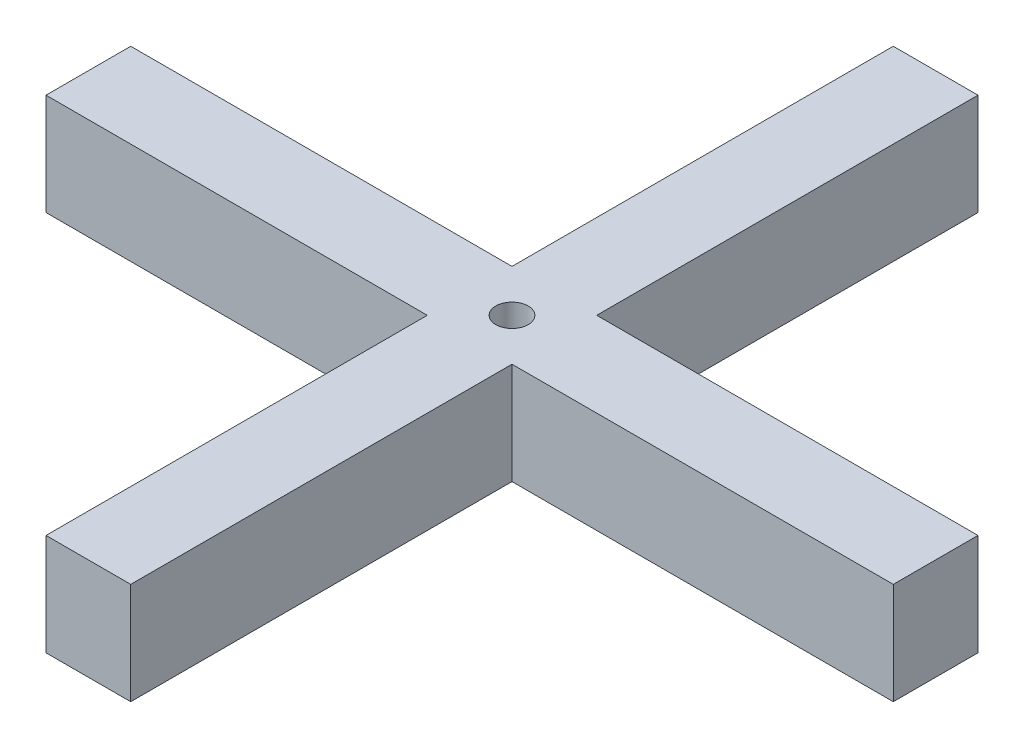
ISO-10303-21;
HEADER;
FILE_DESCRIPTION(('STEP AP214'),'2;1');
FILE_NAME('part.step','',(''),(''),'','','');
FILE_SCHEMA(('AUTOMOTIVE_DESIGN { 1 0 10303 214 1 1 1 1 }'));
ENDSEC;
DATA;
#1=APPLICATION_CONTEXT('core data for automotive mechanical design processes');
#2=APPLICATION_PROTOCOL_DEFINITION('international standard','automotive_design',2000,#1);
#3=PRODUCT_CONTEXT('',#1,'mechanical');
#4=PRODUCT('Part','Part','',(#3));
#5=PRODUCT_RELATED_PRODUCT_CATEGORY('part','',(#4));
#6=PRODUCT_DEFINITION_FORMATION('','',#4);
#7=PRODUCT_DEFINITION_CONTEXT('part definition',#1,'design');
#8=PRODUCT_DEFINITION('design','',#6,#7);
#9=PRODUCT_DEFINITION_SHAPE('','',#8);
#10=(LENGTH_UNIT() NAMED_UNIT(*) SI_UNIT(.MILLI.,.METRE.));
#11=(NAMED_UNIT(*) PLANE_ANGLE_UNIT() SI_UNIT($,.RADIAN.));
#12=(NAMED_UNIT(*) SI_UNIT($,.STERADIAN.) SOLID_ANGLE_UNIT());
#13=UNCERTAINTY_MEASURE_WITH_UNIT(LENGTH_MEASURE(1.E-05),#10,'distance_accuracy_value','');
#14=(GEOMETRIC_REPRESENTATION_CONTEXT(3) GLOBAL_UNCERTAINTY_ASSIGNED_CONTEXT((#13)) GLOBAL_UNIT_ASSIGNED_CONTEXT((#10,
#11,#12)) REPRESENTATION_CONTEXT('',''));
#15=CARTESIAN_POINT('',(0.,0.,0.));
#16=DIRECTION('',(0.,0.,1.));
#17=DIRECTION('',(1.,0.,0.));
#18=AXIS2_PLACEMENT_3D('',#15,#16,#17);
#19=CARTESIAN_POINT('',(3.17500000000001,7.62,0.));
#20=DIRECTION('',(1.,0.,0.));
#21=DIRECTION('',(0.,0.,-1.));
#22=AXIS2_PLACEMENT_3D('',#19,#20,#21);
#23=PLANE('',#22);
#24=DIRECTION('',(0.,0.,1.));
#25=VECTOR('',#24,1.);
#26=CARTESIAN_POINT('',(3.17500000000001,0.,0.));
#27=LINE('',#26,#25);
#28=CARTESIAN_POINT('',(3.175,0.,-31.75));
#29=VERTEX_POINT('',#28);
#30=CARTESIAN_POINT('',(3.17500000000001,0.,-3.175));
#31=VERTEX_POINT('',#30);
#32=EDGE_CURVE('E156',#29,#31,#27,.T.);
#33=ORIENTED_EDGE('',*,*,#32,.F.);
#34=DIRECTION('',(0.,-1.,0.));
#35=VECTOR('',#34,1.);
#36=CARTESIAN_POINT('',(3.175,7.62,-31.75));
#37=LINE('',#36,#35);
#38=CARTESIAN_POINT('',(3.175,7.62,-31.75));
#39=VERTEX_POINT('',#38);
#40=EDGE_CURVE('E12',#39,#29,#37,.T.);
#41=ORIENTED_EDGE('',*,*,#40,.F.);
#42=DIRECTION('',(0.,0.,1.));
#43=VECTOR('',#42,1.);
#44=CARTESIAN_POINT('',(3.17500000000001,7.62,0.));
#45=LINE('',#44,#43);
#46=CARTESIAN_POINT('',(3.17500000000001,7.62,-3.175));
#47=VERTEX_POINT('',#46);
#48=EDGE_CURVE('E176',#39,#47,#45,.T.);
#49=ORIENTED_EDGE('',*,*,#48,.T.);
#50=DIRECTION('',(0.,-1.,0.));
#51=VECTOR('',#50,1.);
#52=CARTESIAN_POINT('',(3.17500000000001,7.62,-3.175));
#53=LINE('',#52,#51);
#54=EDGE_CURVE('E56',#47,#31,#53,.T.);
#55=ORIENTED_EDGE('',*,*,#54,.T.);
#56=EDGE_LOOP('',(#33,#41,#49,#55));
#57=FACE_BOUND('',#56,.T.);
#58=ADVANCED_FACE('F40',(#57),#23,.T.);
#59=CARTESIAN_POINT('',(0.,7.62,-31.75));
#60=DIRECTION('',(0.,0.,-1.));
#61=DIRECTION('',(-1.,0.,0.));
#62=AXIS2_PLACEMENT_3D('',#59,#60,#61);
#63=PLANE('',#62);
#64=DIRECTION('',(1.,0.,0.));
#65=VECTOR('',#64,1.);
#66=CARTESIAN_POINT('',(0.,0.,-31.75));
#67=LINE('',#66,#65);
#68=CARTESIAN_POINT('',(-3.175,0.,-31.75));
#69=VERTEX_POINT('',#68);
#70=EDGE_CURVE('E159',#69,#29,#67,.T.);
#71=ORIENTED_EDGE('',*,*,#70,.F.);
#72=DIRECTION('',(0.,-1.,0.));
#73=VECTOR('',#72,1.);
#74=CARTESIAN_POINT('',(-3.175,7.62,-31.75));
#75=LINE('',#74,#73);
#76=CARTESIAN_POINT('',(-3.175,7.62,-31.75));
#77=VERTEX_POINT('',#76);
#78=EDGE_CURVE('E48',#77,#69,#75,.T.);
#79=ORIENTED_EDGE('',*,*,#78,.F.);
#80=DIRECTION('',(1.,0.,0.));
#81=VECTOR('',#80,1.);
#82=CARTESIAN_POINT('',(0.,7.62,-31.75));
#83=LINE('',#82,#81);
#84=EDGE_CURVE('E250',#77,#39,#83,.T.);
#85=ORIENTED_EDGE('',*,*,#84,.T.);
#86=ORIENTED_EDGE('',*,*,#40,.T.);
#87=EDGE_LOOP('',(#71,#79,#85,#86));
#88=FACE_BOUND('',#87,.T.);
#89=ADVANCED_FACE('F217',(#88),#63,.T.);
#90=CARTESIAN_POINT('',(-3.17499999999999,7.62,0.));
#91=DIRECTION('',(1.,0.,0.));
#92=DIRECTION('',(0.,0.,-1.));
#93=AXIS2_PLACEMENT_3D('',#90,#91,#92);
#94=PLANE('',#93);
#95=DIRECTION('',(0.,0.,1.));
#96=VECTOR('',#95,1.);
#97=CARTESIAN_POINT('',(-3.17499999999999,0.,0.));
#98=LINE('',#97,#96);
#99=CARTESIAN_POINT('',(-3.17499999999999,0.,-3.175));
#100=VERTEX_POINT('',#99);
#101=EDGE_CURVE('E203',#69,#100,#98,.T.);
#102=ORIENTED_EDGE('',*,*,#101,.T.);
#103=DIRECTION('',(0.,-1.,0.));
#104=VECTOR('',#103,1.);
#105=CARTESIAN_POINT('',(-3.17499999999999,7.62,-3.175));
#106=LINE('',#105,#104);
#107=CARTESIAN_POINT('',(-3.17499999999999,7.62,-3.175));
#108=VERTEX_POINT('',#107);
#109=EDGE_CURVE('E196',#108,#100,#106,.T.);
#110=ORIENTED_EDGE('',*,*,#109,.F.);
#111=DIRECTION('',(0.,0.,1.));
#112=VECTOR('',#111,1.);
#113=CARTESIAN_POINT('',(-3.17499999999999,7.62,0.));
#114=LINE('',#113,#112);
#115=EDGE_CURVE('E205',#77,#108,#114,.T.);
#116=ORIENTED_EDGE('',*,*,#115,.F.);
#117=ORIENTED_EDGE('',*,*,#78,.T.);
#118=EDGE_LOOP('',(#102,#110,#116,#117));
#119=FACE_BOUND('',#118,.T.);
#120=ADVANCED_FACE('F201',(#119),#94,.F.);
#121=CARTESIAN_POINT('',(0.,7.62,-3.175));
#122=DIRECTION('',(0.,0.,-1.));
#123=DIRECTION('',(-1.,0.,0.));
#124=AXIS2_PLACEMENT_3D('',#121,#122,#123);
#125=PLANE('',#124);
#126=DIRECTION('',(1.,0.,0.));
#127=VECTOR('',#126,1.);
#128=CARTESIAN_POINT('',(0.,0.,-3.175));
#129=LINE('',#128,#127);
#130=CARTESIAN_POINT('',(-31.75,0.,-3.175));
#131=VERTEX_POINT('',#130);
#132=EDGE_CURVE('E215',#131,#100,#129,.T.);
#133=ORIENTED_EDGE('',*,*,#132,.F.);
#134=DIRECTION('',(0.,-1.,0.));
#135=VECTOR('',#134,1.);
#136=CARTESIAN_POINT('',(-31.75,7.62,-3.175));
#137=LINE('',#136,#135);
#138=CARTESIAN_POINT('',(-31.75,7.62,-3.175));
#139=VERTEX_POINT('',#138);
#140=EDGE_CURVE('E194',#139,#131,#137,.T.);
#141=ORIENTED_EDGE('',*,*,#140,.F.);
#142=DIRECTION('',(1.,0.,0.));
#143=VECTOR('',#142,1.);
#144=CARTESIAN_POINT('',(0.,7.62,-3.175));
#145=LINE('',#144,#143);
#146=EDGE_CURVE('E253',#139,#108,#145,.T.);
#147=ORIENTED_EDGE('',*,*,#146,.T.);
#148=ORIENTED_EDGE('',*,*,#109,.T.);
#149=EDGE_LOOP('',(#133,#141,#147,#148));
#150=FACE_BOUND('',#149,.T.);
#151=ADVANCED_FACE('F286',(#150),#125,.T.);
#152=CARTESIAN_POINT('',(-31.75,7.62,0.));
#153=DIRECTION('',(1.,0.,0.));
#154=DIRECTION('',(0.,0.,-1.));
#155=AXIS2_PLACEMENT_3D('',#152,#153,#154);
#156=PLANE('',#155);
#157=DIRECTION('',(0.,0.,1.));
#158=VECTOR('',#157,1.);
#159=CARTESIAN_POINT('',(-31.75,0.,0.));
#160=LINE('',#159,#158);
#161=CARTESIAN_POINT('',(-31.75,0.,3.175));
#162=VERTEX_POINT('',#161);
#163=EDGE_CURVE('E221',#131,#162,#160,.T.);
#164=ORIENTED_EDGE('',*,*,#163,.T.);
#165=DIRECTION('',(0.,-1.,0.));
#166=VECTOR('',#165,1.);
#167=CARTESIAN_POINT('',(-31.75,7.62,3.175));
#168=LINE('',#167,#166);
#169=CARTESIAN_POINT('',(-31.75,7.62,3.175));
#170=VERTEX_POINT('',#169);
#171=EDGE_CURVE('E191',#170,#162,#168,.T.);
#172=ORIENTED_EDGE('',*,*,#171,.F.);
#173=DIRECTION('',(0.,0.,1.));
#174=VECTOR('',#173,1.);
#175=CARTESIAN_POINT('',(-31.75,7.62,0.));
#176=LINE('',#175,#174);
#177=EDGE_CURVE('E256',#139,#170,#176,.T.);
#178=ORIENTED_EDGE('',*,*,#177,.F.);
#179=ORIENTED_EDGE('',*,*,#140,.T.);
#180=EDGE_LOOP('',(#164,#172,#178,#179));
#181=FACE_BOUND('',#180,.T.);
#182=ADVANCED_FACE('F291',(#181),#156,.F.);
#183=CARTESIAN_POINT('',(0.,7.62,3.175));
#184=DIRECTION('',(0.,0.,-1.));
#185=DIRECTION('',(-1.,0.,0.));
#186=AXIS2_PLACEMENT_3D('',#183,#184,#185);
#187=PLANE('',#186);
#188=DIRECTION('',(1.,0.,0.));
#189=VECTOR('',#188,1.);
#190=CARTESIAN_POINT('',(0.,0.,3.175));
#191=LINE('',#190,#189);
#192=CARTESIAN_POINT('',(-3.17499999999999,0.,3.175));
#193=VERTEX_POINT('',#192);
#194=EDGE_CURVE('E224',#162,#193,#191,.T.);
#195=ORIENTED_EDGE('',*,*,#194,.T.);
#196=DIRECTION('',(0.,-1.,0.));
#197=VECTOR('',#196,1.);
#198=CARTESIAN_POINT('',(-3.17499999999999,7.62,3.175));
#199=LINE('',#198,#197);
#200=CARTESIAN_POINT('',(-3.17499999999999,7.62,3.175));
#201=VERTEX_POINT('',#200);
#202=EDGE_CURVE('E188',#201,#193,#199,.T.);
#203=ORIENTED_EDGE('',*,*,#202,.F.);
#204=DIRECTION('',(1.,0.,0.));
#205=VECTOR('',#204,1.);
#206=CARTESIAN_POINT('',(0.,7.62,3.175));
#207=LINE('',#206,#205);
#208=EDGE_CURVE('E258',#170,#201,#207,.T.);
#209=ORIENTED_EDGE('',*,*,#208,.F.);
#210=ORIENTED_EDGE('',*,*,#171,.T.);
#211=EDGE_LOOP('',(#195,#203,#209,#210));
#212=FACE_BOUND('',#211,.T.);
#213=ADVANCED_FACE('F295',(#212),#187,.F.);
#214=CARTESIAN_POINT('',(-3.17499999999999,7.62,0.));
#215=DIRECTION('',(1.,0.,0.));
#216=DIRECTION('',(0.,0.,-1.));
#217=AXIS2_PLACEMENT_3D('',#214,#215,#216);
#218=PLANE('',#217);
#219=DIRECTION('',(0.,0.,1.));
#220=VECTOR('',#219,1.);
#221=CARTESIAN_POINT('',(-3.17499999999999,0.,0.));
#222=LINE('',#221,#220);
#223=CARTESIAN_POINT('',(-3.17499999999999,0.,31.75));
#224=VERTEX_POINT('',#223);
#225=EDGE_CURVE('E227',#193,#224,#222,.T.);
#226=ORIENTED_EDGE('',*,*,#225,.T.);
#227=DIRECTION('',(0.,-1.,0.));
#228=VECTOR('',#227,1.);
#229=CARTESIAN_POINT('',(-3.17499999999999,7.62,31.75));
#230=LINE('',#229,#228);
#231=CARTESIAN_POINT('',(-3.17499999999999,7.62,31.75));
#232=VERTEX_POINT('',#231);
#233=EDGE_CURVE('E185',#232,#224,#230,.T.);
#234=ORIENTED_EDGE('',*,*,#233,.F.);
#235=DIRECTION('',(0.,0.,1.));
#236=VECTOR('',#235,1.);
#237=CARTESIAN_POINT('',(-3.17499999999999,7.62,0.));
#238=LINE('',#237,#236);
#239=EDGE_CURVE('E260',#201,#232,#238,.T.);
#240=ORIENTED_EDGE('',*,*,#239,.F.);
#241=ORIENTED_EDGE('',*,*,#202,.T.);
#242=EDGE_LOOP('',(#226,#234,#240,#241));
#243=FACE_BOUND('',#242,.T.);
#244=ADVANCED_FACE('F299',(#243),#218,.F.);
#245=CARTESIAN_POINT('',(0.,7.62,31.75));
#246=DIRECTION('',(0.,0.,-1.));
#247=DIRECTION('',(-1.,0.,0.));
#248=AXIS2_PLACEMENT_3D('',#245,#246,#247);
#249=PLANE('',#248);
#250=DIRECTION('',(1.,0.,0.));
#251=VECTOR('',#250,1.);
#252=CARTESIAN_POINT('',(0.,0.,31.75));
#253=LINE('',#252,#251);
#254=CARTESIAN_POINT('',(3.17500000000001,0.,31.75));
#255=VERTEX_POINT('',#254);
#256=EDGE_CURVE('E230',#224,#255,#253,.T.);
#257=ORIENTED_EDGE('',*,*,#256,.T.);
#258=DIRECTION('',(0.,-1.,0.));
#259=VECTOR('',#258,1.);
#260=CARTESIAN_POINT('',(3.17500000000001,7.62,31.75));
#261=LINE('',#260,#259);
#262=CARTESIAN_POINT('',(3.17500000000001,7.62,31.75));
#263=VERTEX_POINT('',#262);
#264=EDGE_CURVE('E183',#263,#255,#261,.T.);
#265=ORIENTED_EDGE('',*,*,#264,.F.);
#266=DIRECTION('',(1.,0.,0.));
#267=VECTOR('',#266,1.);
#268=CARTESIAN_POINT('',(0.,7.62,31.75));
#269=LINE('',#268,#267);
#270=EDGE_CURVE('E262',#232,#263,#269,.T.);
#271=ORIENTED_EDGE('',*,*,#270,.F.);
#272=ORIENTED_EDGE('',*,*,#233,.T.);
#273=EDGE_LOOP('',(#257,#265,#271,#272));
#274=FACE_BOUND('',#273,.T.);
#275=ADVANCED_FACE('F303',(#274),#249,.F.);
#276=CARTESIAN_POINT('',(3.17500000000001,7.62,0.));
#277=DIRECTION('',(1.,0.,0.));
#278=DIRECTION('',(0.,0.,-1.));
#279=AXIS2_PLACEMENT_3D('',#276,#277,#278);
#280=PLANE('',#279);
#281=DIRECTION('',(0.,0.,1.));
#282=VECTOR('',#281,1.);
#283=CARTESIAN_POINT('',(3.17500000000001,0.,0.));
#284=LINE('',#283,#282);
#285=CARTESIAN_POINT('',(3.17500000000001,0.,3.175));
#286=VERTEX_POINT('',#285);
#287=EDGE_CURVE('E234',#286,#255,#284,.T.);
#288=ORIENTED_EDGE('',*,*,#287,.F.);
#289=DIRECTION('',(0.,-1.,0.));
#290=VECTOR('',#289,1.);
#291=CARTESIAN_POINT('',(3.17500000000001,7.62,3.175));
#292=LINE('',#291,#290);
#293=CARTESIAN_POINT('',(3.17500000000001,7.62,3.175));
#294=VERTEX_POINT('',#293);
#295=EDGE_CURVE('E148',#294,#286,#292,.T.);
#296=ORIENTED_EDGE('',*,*,#295,.F.);
#297=DIRECTION('',(0.,0.,1.));
#298=VECTOR('',#297,1.);
#299=CARTESIAN_POINT('',(3.17500000000001,7.62,0.));
#300=LINE('',#299,#298);
#301=EDGE_CURVE('E138',#294,#263,#300,.T.);
#302=ORIENTED_EDGE('',*,*,#301,.T.);
#303=ORIENTED_EDGE('',*,*,#264,.T.);
#304=EDGE_LOOP('',(#288,#296,#302,#303));
#305=FACE_BOUND('',#304,.T.);
#306=ADVANCED_FACE('F265',(#305),#280,.T.);
#307=CARTESIAN_POINT('',(0.,7.62,3.175));
#308=DIRECTION('',(0.,0.,-1.));
#309=DIRECTION('',(-1.,0.,0.));
#310=AXIS2_PLACEMENT_3D('',#307,#308,#309);
#311=PLANE('',#310);
#312=DIRECTION('',(1.,0.,0.));
#313=VECTOR('',#312,1.);
#314=CARTESIAN_POINT('',(0.,0.,3.175));
#315=LINE('',#314,#313);
#316=CARTESIAN_POINT('',(31.75,0.,3.175));
#317=VERTEX_POINT('',#316);
#318=EDGE_CURVE('E145',#286,#317,#315,.T.);
#319=ORIENTED_EDGE('',*,*,#318,.T.);
#320=DIRECTION('',(0.,-1.,0.));
#321=VECTOR('',#320,1.);
#322=CARTESIAN_POINT('',(31.75,7.62,3.175));
#323=LINE('',#322,#321);
#324=CARTESIAN_POINT('',(31.75,7.62,3.175));
#325=VERTEX_POINT('',#324);
#326=EDGE_CURVE('E142',#325,#317,#323,.T.);
#327=ORIENTED_EDGE('',*,*,#326,.F.);
#328=DIRECTION('',(1.,0.,0.));
#329=VECTOR('',#328,1.);
#330=CARTESIAN_POINT('',(0.,7.62,3.175));
#331=LINE('',#330,#329);
#332=EDGE_CURVE('E131',#294,#325,#331,.T.);
#333=ORIENTED_EDGE('',*,*,#332,.F.);
#334=ORIENTED_EDGE('',*,*,#295,.T.);
#335=EDGE_LOOP('',(#319,#327,#333,#334));
#336=FACE_BOUND('',#335,.T.);
#337=ADVANCED_FACE('F143',(#336),#311,.F.);
#338=CARTESIAN_POINT('',(31.75,7.62,0.));
#339=DIRECTION('',(1.,0.,0.));
#340=DIRECTION('',(0.,0.,-1.));
#341=AXIS2_PLACEMENT_3D('',#338,#339,#340);
#342=PLANE('',#341);
#343=DIRECTION('',(0.,0.,1.));
#344=VECTOR('',#343,1.);
#345=CARTESIAN_POINT('',(31.75,0.,0.));
#346=LINE('',#345,#344);
#347=CARTESIAN_POINT('',(31.75,0.,-3.175));
#348=VERTEX_POINT('',#347);
#349=EDGE_CURVE('E177',#348,#317,#346,.T.);
#350=ORIENTED_EDGE('',*,*,#349,.F.);
#351=DIRECTION('',(0.,-1.,0.));
#352=VECTOR('',#351,1.);
#353=CARTESIAN_POINT('',(31.75,7.62,-3.175));
#354=LINE('',#353,#352);
#355=CARTESIAN_POINT('',(31.75,7.62,-3.175));
#356=VERTEX_POINT('',#355);
#357=EDGE_CURVE('E93',#356,#348,#354,.T.);
#358=ORIENTED_EDGE('',*,*,#357,.F.);
#359=DIRECTION('',(0.,0.,1.));
#360=VECTOR('',#359,1.);
#361=CARTESIAN_POINT('',(31.75,7.62,0.));
#362=LINE('',#361,#360);
#363=EDGE_CURVE('E136',#356,#325,#362,.T.);
#364=ORIENTED_EDGE('',*,*,#363,.T.);
#365=ORIENTED_EDGE('',*,*,#326,.T.);
#366=EDGE_LOOP('',(#350,#358,#364,#365));
#367=FACE_BOUND('',#366,.T.);
#368=ADVANCED_FACE('F150',(#367),#342,.T.);
#369=CARTESIAN_POINT('',(0.,7.62,-3.175));
#370=DIRECTION('',(0.,0.,-1.));
#371=DIRECTION('',(-1.,0.,0.));
#372=AXIS2_PLACEMENT_3D('',#369,#370,#371);
#373=PLANE('',#372);
#374=DIRECTION('',(1.,0.,0.));
#375=VECTOR('',#374,1.);
#376=CARTESIAN_POINT('',(0.,0.,-3.175));
#377=LINE('',#376,#375);
#378=EDGE_CURVE('E171',#31,#348,#377,.T.);
#379=ORIENTED_EDGE('',*,*,#378,.F.);
#380=ORIENTED_EDGE('',*,*,#54,.F.);
#381=DIRECTION('',(1.,0.,0.));
#382=VECTOR('',#381,1.);
#383=CARTESIAN_POINT('',(0.,7.62,-3.175));
#384=LINE('',#383,#382);
#385=EDGE_CURVE('E151',#47,#356,#384,.T.);
#386=ORIENTED_EDGE('',*,*,#385,.T.);
#387=ORIENTED_EDGE('',*,*,#357,.T.);
#388=EDGE_LOOP('',(#379,#380,#386,#387));
#389=FACE_BOUND('',#388,.T.);
#390=ADVANCED_FACE('F268',(#389),#373,.T.);
#391=CARTESIAN_POINT('',(0.,7.62,0.));
#392=DIRECTION('',(0.,1.,0.));
#393=DIRECTION('',(0.,0.,1.));
#394=AXIS2_PLACEMENT_3D('',#391,#392,#393);
#395=PLANE('',#394);
#396=CARTESIAN_POINT('',(0.,7.62,0.));
#397=DIRECTION('',(0.,1.,0.));
#398=DIRECTION('',(0.,0.,1.));
#399=AXIS2_PLACEMENT_3D('',#396,#397,#398);
#400=CIRCLE('',#399,1.213900036);
#401=CARTESIAN_POINT('',(0.,7.62,1.213900036));
#402=VERTEX_POINT('',#401);
#403=EDGE_CURVE('E242',#402,#402,#400,.T.);
#404=ORIENTED_EDGE('',*,*,#403,.F.);
#405=EDGE_LOOP('',(#404));
#406=FACE_BOUND('',#405,.T.);
#407=ORIENTED_EDGE('',*,*,#48,.F.);
#408=ORIENTED_EDGE('',*,*,#84,.F.);
#409=ORIENTED_EDGE('',*,*,#115,.T.);
#410=ORIENTED_EDGE('',*,*,#146,.F.);
#411=ORIENTED_EDGE('',*,*,#177,.T.);
#412=ORIENTED_EDGE('',*,*,#208,.T.);
#413=ORIENTED_EDGE('',*,*,#239,.T.);
#414=ORIENTED_EDGE('',*,*,#270,.T.);
#415=ORIENTED_EDGE('',*,*,#301,.F.);
#416=ORIENTED_EDGE('',*,*,#332,.T.);
#417=ORIENTED_EDGE('',*,*,#363,.F.);
#418=ORIENTED_EDGE('',*,*,#385,.F.);
#419=EDGE_LOOP('',(#407,#408,#409,#410,#411,#412,#413,#414,#415,#416,#417,#418));
#420=FACE_BOUND('',#419,.T.);
#421=ADVANCED_FACE('F133',(#406,#420),#395,.T.);
#422=CARTESIAN_POINT('',(0.,0.,0.));
#423=DIRECTION('',(0.,1.,0.));
#424=DIRECTION('',(0.,0.,1.));
#425=AXIS2_PLACEMENT_3D('',#422,#423,#424);
#426=PLANE('',#425);
#427=CARTESIAN_POINT('',(0.,0.,0.));
#428=DIRECTION('',(0.,1.,0.));
#429=DIRECTION('',(0.,0.,1.));
#430=AXIS2_PLACEMENT_3D('',#427,#428,#429);
#431=CIRCLE('',#430,1.213900036);
#432=CARTESIAN_POINT('',(0.,0.,1.213900036));
#433=VERTEX_POINT('',#432);
#434=EDGE_CURVE('E160',#433,#433,#431,.T.);
#435=ORIENTED_EDGE('',*,*,#434,.T.);
#436=EDGE_LOOP('',(#435));
#437=FACE_BOUND('',#436,.T.);
#438=ORIENTED_EDGE('',*,*,#32,.T.);
#439=ORIENTED_EDGE('',*,*,#378,.T.);
#440=ORIENTED_EDGE('',*,*,#349,.T.);
#441=ORIENTED_EDGE('',*,*,#318,.F.);
#442=ORIENTED_EDGE('',*,*,#287,.T.);
#443=ORIENTED_EDGE('',*,*,#256,.F.);
#444=ORIENTED_EDGE('',*,*,#225,.F.);
#445=ORIENTED_EDGE('',*,*,#194,.F.);
#446=ORIENTED_EDGE('',*,*,#163,.F.);
#447=ORIENTED_EDGE('',*,*,#132,.T.);
#448=ORIENTED_EDGE('',*,*,#101,.F.);
#449=ORIENTED_EDGE('',*,*,#70,.T.);
#450=EDGE_LOOP('',(#438,#439,#440,#441,#442,#443,#444,#445,#446,#447,#448,#449));
#451=FACE_BOUND('',#450,.T.);
#452=ADVANCED_FACE('F212',(#437,#451),#426,.F.);
#453=CARTESIAN_POINT('',(0.,0.,0.));
#454=DIRECTION('',(0.,1.,0.));
#455=DIRECTION('',(0.,0.,1.));
#456=AXIS2_PLACEMENT_3D('',#453,#454,#455);
#457=CYLINDRICAL_SURFACE('',#456,1.213900036);
#458=CARTESIAN_POINT('',(0.,0.,1.213900036));
#459=CARTESIAN_POINT('',(0.,0.0793749999999998,1.213900036));
#460=CARTESIAN_POINT('',(0.,0.15875,1.213900036));
#461=CARTESIAN_POINT('',(0.,0.3175,1.213900036));
#462=CARTESIAN_POINT('',(0.,0.396875,1.213900036));
#463=CARTESIAN_POINT('',(0.,0.555625,1.213900036));
#464=CARTESIAN_POINT('',(0.,0.635,1.213900036));
#465=CARTESIAN_POINT('',(0.,0.79375,1.213900036));
#466=CARTESIAN_POINT('',(0.,0.873125,1.213900036));
#467=CARTESIAN_POINT('',(0.,1.031875,1.213900036));
#468=CARTESIAN_POINT('',(0.,1.11125,1.213900036));
#469=CARTESIAN_POINT('',(0.,1.27,1.213900036));
#470=CARTESIAN_POINT('',(0.,1.349375,1.213900036));
#471=CARTESIAN_POINT('',(0.,1.508125,1.213900036));
#472=CARTESIAN_POINT('',(0.,1.5875,1.213900036));
#473=CARTESIAN_POINT('',(0.,1.74625,1.213900036));
#474=CARTESIAN_POINT('',(0.,1.825625,1.213900036));
#475=CARTESIAN_POINT('',(0.,1.984375,1.213900036));
#476=CARTESIAN_POINT('',(0.,2.06375,1.213900036));
#477=CARTESIAN_POINT('',(0.,2.2225,1.213900036));
#478=CARTESIAN_POINT('',(0.,2.301875,1.213900036));
#479=CARTESIAN_POINT('',(0.,2.460625,1.213900036));
#480=CARTESIAN_POINT('',(0.,2.54,1.213900036));
#481=CARTESIAN_POINT('',(0.,2.69875,1.213900036));
#482=CARTESIAN_POINT('',(0.,2.778125,1.213900036));
#483=CARTESIAN_POINT('',(0.,2.936875,1.213900036));
#484=CARTESIAN_POINT('',(0.,3.01625,1.213900036));
#485=CARTESIAN_POINT('',(0.,3.175,1.213900036));
#486=CARTESIAN_POINT('',(0.,3.254375,1.213900036));
#487=CARTESIAN_POINT('',(0.,3.413125,1.213900036));
#488=CARTESIAN_POINT('',(0.,3.4925,1.213900036));
#489=CARTESIAN_POINT('',(0.,3.65125,1.213900036));
#490=CARTESIAN_POINT('',(0.,3.730625,1.213900036));
#491=CARTESIAN_POINT('',(0.,3.889375,1.213900036));
#492=CARTESIAN_POINT('',(0.,3.96875,1.213900036));
#493=CARTESIAN_POINT('',(0.,4.1275,1.213900036));
#494=CARTESIAN_POINT('',(0.,4.206875,1.213900036));
#495=CARTESIAN_POINT('',(0.,4.365625,1.213900036));
#496=CARTESIAN_POINT('',(0.,4.445,1.213900036));
#497=CARTESIAN_POINT('',(0.,4.60375,1.213900036));
#498=CARTESIAN_POINT('',(0.,4.683125,1.213900036));
#499=CARTESIAN_POINT('',(0.,4.841875,1.213900036));
#500=CARTESIAN_POINT('',(0.,4.92125,1.213900036));
#501=CARTESIAN_POINT('',(0.,5.08,1.213900036));
#502=CARTESIAN_POINT('',(0.,5.159375,1.213900036));
#503=CARTESIAN_POINT('',(0.,5.318125,1.213900036));
#504=CARTESIAN_POINT('',(0.,5.3975,1.213900036));
#505=CARTESIAN_POINT('',(0.,5.55625,1.213900036));
#506=CARTESIAN_POINT('',(0.,5.635625,1.213900036));
#507=CARTESIAN_POINT('',(0.,5.794375,1.213900036));
#508=CARTESIAN_POINT('',(0.,5.87375,1.213900036));
#509=CARTESIAN_POINT('',(0.,6.0325,1.213900036));
#510=CARTESIAN_POINT('',(0.,6.111875,1.213900036));
#511=CARTESIAN_POINT('',(0.,6.270625,1.213900036));
#512=CARTESIAN_POINT('',(0.,6.35,1.213900036));
#513=CARTESIAN_POINT('',(0.,6.50875,1.213900036));
#514=CARTESIAN_POINT('',(0.,6.588125,1.213900036));
#515=CARTESIAN_POINT('',(0.,6.746875,1.213900036));
#516=CARTESIAN_POINT('',(0.,6.82625,1.213900036));
#517=CARTESIAN_POINT('',(0.,6.985,1.213900036));
#518=CARTESIAN_POINT('',(0.,7.064375,1.213900036));
#519=CARTESIAN_POINT('',(0.,7.223125,1.213900036));
#520=CARTESIAN_POINT('',(0.,7.3025,1.213900036));
#521=CARTESIAN_POINT('',(0.,7.46125,1.213900036));
#522=CARTESIAN_POINT('',(0.,7.540625,1.213900036));
#523=CARTESIAN_POINT('',(0.,7.62,1.213900036));
#524=B_SPLINE_CURVE_WITH_KNOTS('',3,(#458,#459,#460,#461,#462,#463,#464,#465,#466,#467,#468,
#469,#470,#471,#472,#473,#474,#475,#476,#477,#478,#479,#480,#481,#482,#483,#484,#485,#486,#487,
#488,#489,#490,#491,#492,#493,#494,#495,#496,#497,#498,#499,#500,#501,#502,#503,#504,#505,#506,
#507,#508,#509,#510,#511,#512,#513,#514,#515,#516,#517,#518,#519,#520,#521,#522,#523),
.UNSPECIFIED.,.F.,.F.,(4,2,2,2,2,2,2,2,2,2,2,2,2,2,2,2,2,2,2,2,2,2,2,2,2,2,2,2,2,2,2,2,4),(0.,
0.238125,0.47625,0.714375,0.9525,1.190625,1.42875,1.666875,1.905,2.143125,2.38125,2.619375,
2.8575,3.095625,3.33375,3.571875,3.81,4.048125,4.28625,4.524375,4.7625,5.000625,5.23875,
5.476875,5.715,5.953125,6.19125,6.429375,6.6675,6.905625,7.14375,7.381875,7.62),.UNSPECIFIED.);
#525=EDGE_CURVE('BSEAM341',#433,#402,#524,.T.);
#526=ORIENTED_EDGE('',*,*,#434,.F.);
#527=ORIENTED_EDGE('',*,*,#403,.T.);
#528=ORIENTED_EDGE('',*,*,#525,.T.);
#529=ORIENTED_EDGE('',*,*,#525,.F.);
#530=EDGE_LOOP('',(#526,#528,#527,#529));
#531=FACE_BOUND('',#530,.T.);
#532=ADVANCED_FACE('F341',(#531),#457,.F.);
#533=CLOSED_SHELL('',(#58,#89,#120,#151,#182,#213,#244,#275,#306,#337,#368,#390,#421,#452,#532));
#534=MANIFOLD_SOLID_BREP('B2',#533);
#535=ADVANCED_BREP_SHAPE_REPRESENTATION('',(#18,#534),#14);
#536=SHAPE_DEFINITION_REPRESENTATION(#9,#535);
ENDSEC;
END-ISO-10303-21;
